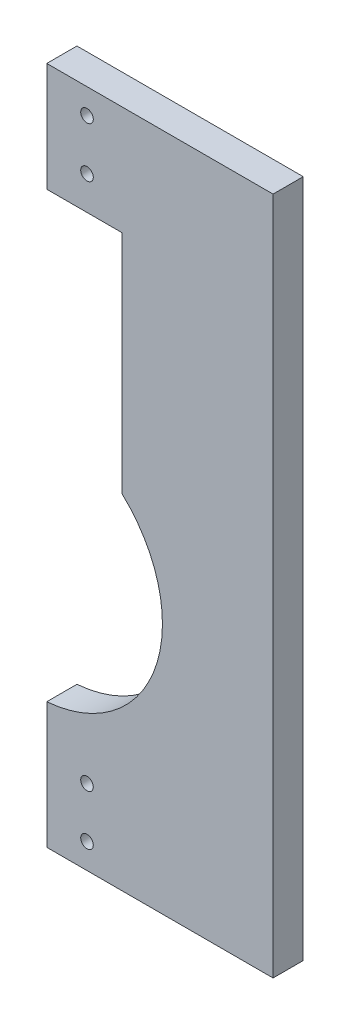
ISO-10303-21;
HEADER;
FILE_DESCRIPTION(('STEP AP214'),'2;1');
FILE_NAME('part.step','',(''),(''),'','','');
FILE_SCHEMA(('AUTOMOTIVE_DESIGN { 1 0 10303 214 1 1 1 1 }'));
ENDSEC;
DATA;
#1=APPLICATION_CONTEXT('core data for automotive mechanical design processes');
#2=APPLICATION_PROTOCOL_DEFINITION('international standard','automotive_design',2000,#1);
#3=PRODUCT_CONTEXT('',#1,'mechanical');
#4=PRODUCT('Part','Part','',(#3));
#5=PRODUCT_RELATED_PRODUCT_CATEGORY('part','',(#4));
#6=PRODUCT_DEFINITION_FORMATION('','',#4);
#7=PRODUCT_DEFINITION_CONTEXT('part definition',#1,'design');
#8=PRODUCT_DEFINITION('design','',#6,#7);
#9=PRODUCT_DEFINITION_SHAPE('','',#8);
#10=(LENGTH_UNIT() NAMED_UNIT(*) SI_UNIT(.MILLI.,.METRE.));
#11=(NAMED_UNIT(*) PLANE_ANGLE_UNIT() SI_UNIT($,.RADIAN.));
#12=(NAMED_UNIT(*) SI_UNIT($,.STERADIAN.) SOLID_ANGLE_UNIT());
#13=UNCERTAINTY_MEASURE_WITH_UNIT(LENGTH_MEASURE(1.E-05),#10,'distance_accuracy_value','');
#14=(GEOMETRIC_REPRESENTATION_CONTEXT(3) GLOBAL_UNCERTAINTY_ASSIGNED_CONTEXT((#13)) GLOBAL_UNIT_ASSIGNED_CONTEXT((#10,
#11,#12)) REPRESENTATION_CONTEXT('',''));
#15=CARTESIAN_POINT('',(0.,0.,0.));
#16=DIRECTION('',(0.,0.,1.));
#17=DIRECTION('',(1.,0.,0.));
#18=AXIS2_PLACEMENT_3D('',#15,#16,#17);
#19=CARTESIAN_POINT('',(0.,0.,6.));
#20=DIRECTION('',(1.,0.,0.));
#21=DIRECTION('',(0.,0.,-1.));
#22=AXIS2_PLACEMENT_3D('',#19,#20,#21);
#23=PLANE('',#22);
#24=DIRECTION('',(0.,-1.,0.));
#25=VECTOR('',#24,1.);
#26=CARTESIAN_POINT('',(0.,0.,6.));
#27=LINE('',#26,#25);
#28=CARTESIAN_POINT('',(0.,25.0801284112458,6.));
#29=VERTEX_POINT('',#28);
#30=CARTESIAN_POINT('',(0.,0.,6.));
#31=VERTEX_POINT('',#30);
#32=EDGE_CURVE('E122',#29,#31,#27,.T.);
#33=ORIENTED_EDGE('',*,*,#32,.F.);
#34=DIRECTION('',(0.,0.,-1.));
#35=VECTOR('',#34,1.);
#36=CARTESIAN_POINT('',(0.,25.0801284112458,6.));
#37=LINE('',#36,#35);
#38=CARTESIAN_POINT('',(0.,25.0801284112458,0.));
#39=VERTEX_POINT('',#38);
#40=EDGE_CURVE('E107',#29,#39,#37,.T.);
#41=ORIENTED_EDGE('',*,*,#40,.T.);
#42=DIRECTION('',(0.,-1.,0.));
#43=VECTOR('',#42,1.);
#44=CARTESIAN_POINT('',(0.,0.,0.));
#45=LINE('',#44,#43);
#46=CARTESIAN_POINT('',(0.,0.,0.));
#47=VERTEX_POINT('',#46);
#48=EDGE_CURVE('E143',#39,#47,#45,.T.);
#49=ORIENTED_EDGE('',*,*,#48,.T.);
#50=DIRECTION('',(0.,0.,-1.));
#51=VECTOR('',#50,1.);
#52=CARTESIAN_POINT('',(0.,0.,6.));
#53=LINE('',#52,#51);
#54=EDGE_CURVE('E127',#31,#47,#53,.T.);
#55=ORIENTED_EDGE('',*,*,#54,.F.);
#56=EDGE_LOOP('',(#33,#41,#49,#55));
#57=FACE_BOUND('',#56,.T.);
#58=ADVANCED_FACE('F33',(#57),#23,.F.);
#59=CARTESIAN_POINT('',(0.,0.,6.));
#60=DIRECTION('',(0.,0.,-1.));
#61=DIRECTION('',(-1.,0.,0.));
#62=AXIS2_PLACEMENT_3D('',#59,#60,#61);
#63=PLANE('',#62);
#64=CARTESIAN_POINT('',(7.99999999999999,120.,6.));
#65=DIRECTION('',(0.,0.,1.));
#66=DIRECTION('',(-1.,0.,0.));
#67=AXIS2_PLACEMENT_3D('',#64,#65,#66);
#68=CIRCLE('',#67,1.25);
#69=CARTESIAN_POINT('',(6.74999999999999,120.,6.));
#70=VERTEX_POINT('',#69);
#71=EDGE_CURVE('E180',#70,#70,#68,.T.);
#72=ORIENTED_EDGE('',*,*,#71,.F.);
#73=EDGE_LOOP('',(#72));
#74=FACE_BOUND('',#73,.T.);
#75=CARTESIAN_POINT('',(8.,5.,6.));
#76=DIRECTION('',(0.,0.,1.));
#77=DIRECTION('',(1.,0.,0.));
#78=AXIS2_PLACEMENT_3D('',#75,#76,#77);
#79=CIRCLE('',#78,1.25);
#80=CARTESIAN_POINT('',(9.25,5.,6.));
#81=VERTEX_POINT('',#80);
#82=EDGE_CURVE('E141',#81,#81,#79,.T.);
#83=ORIENTED_EDGE('',*,*,#82,.F.);
#84=EDGE_LOOP('',(#83));
#85=FACE_BOUND('',#84,.T.);
#86=DIRECTION('',(0.,-1.,0.));
#87=VECTOR('',#86,1.);
#88=CARTESIAN_POINT('',(15.,113.330302779823,6.));
#89=LINE('',#88,#87);
#90=CARTESIAN_POINT('',(15.,113.330302779823,6.));
#91=VERTEX_POINT('',#90);
#92=CARTESIAN_POINT('',(15.,68.3303027798234,6.));
#93=VERTEX_POINT('',#92);
#94=EDGE_CURVE('E118',#91,#93,#89,.T.);
#95=ORIENTED_EDGE('',*,*,#94,.T.);
#96=CARTESIAN_POINT('',(-2.00000000000001,50.,6.));
#97=DIRECTION('',(0.,0.,-1.));
#98=DIRECTION('',(1.,0.,0.));
#99=AXIS2_PLACEMENT_3D('',#96,#97,#98);
#100=CIRCLE('',#99,25.);
#101=EDGE_CURVE('E110',#93,#29,#100,.T.);
#102=ORIENTED_EDGE('',*,*,#101,.T.);
#103=ORIENTED_EDGE('',*,*,#32,.T.);
#104=DIRECTION('',(1.,0.,0.));
#105=VECTOR('',#104,1.);
#106=CARTESIAN_POINT('',(0.,0.,6.));
#107=LINE('',#106,#105);
#108=CARTESIAN_POINT('',(45.,0.,6.));
#109=VERTEX_POINT('',#108);
#110=EDGE_CURVE('E57',#31,#109,#107,.T.);
#111=ORIENTED_EDGE('',*,*,#110,.T.);
#112=DIRECTION('',(0.,1.,0.));
#113=VECTOR('',#112,1.);
#114=CARTESIAN_POINT('',(45.,0.,6.));
#115=LINE('',#114,#113);
#116=CARTESIAN_POINT('',(45.,135.,6.));
#117=VERTEX_POINT('',#116);
#118=EDGE_CURVE('E131',#109,#117,#115,.T.);
#119=ORIENTED_EDGE('',*,*,#118,.T.);
#120=DIRECTION('',(-1.,0.,0.));
#121=VECTOR('',#120,1.);
#122=CARTESIAN_POINT('',(0.,135.,6.));
#123=LINE('',#122,#121);
#124=CARTESIAN_POINT('',(0.,135.,6.));
#125=VERTEX_POINT('',#124);
#126=EDGE_CURVE('E85',#117,#125,#123,.T.);
#127=ORIENTED_EDGE('',*,*,#126,.T.);
#128=CARTESIAN_POINT('',(0.,113.330302779823,6.));
#129=VERTEX_POINT('',#128);
#130=EDGE_CURVE('E128',#125,#129,#27,.T.);
#131=ORIENTED_EDGE('',*,*,#130,.T.);
#132=DIRECTION('',(1.,0.,0.));
#133=VECTOR('',#132,1.);
#134=CARTESIAN_POINT('',(0.,113.330302779823,6.));
#135=LINE('',#134,#133);
#136=EDGE_CURVE('E48',#129,#91,#135,.T.);
#137=ORIENTED_EDGE('',*,*,#136,.T.);
#138=EDGE_LOOP('',(#95,#102,#103,#111,#119,#127,#131,#137));
#139=FACE_BOUND('',#138,.T.);
#140=CARTESIAN_POINT('',(7.99999999999997,15.,6.));
#141=DIRECTION('',(0.,0.,1.));
#142=DIRECTION('',(1.,0.,0.));
#143=AXIS2_PLACEMENT_3D('',#140,#141,#142);
#144=CIRCLE('',#143,1.25);
#145=CARTESIAN_POINT('',(9.24999999999997,15.,6.));
#146=VERTEX_POINT('',#145);
#147=EDGE_CURVE('E186',#146,#146,#144,.T.);
#148=ORIENTED_EDGE('',*,*,#147,.F.);
#149=EDGE_LOOP('',(#148));
#150=FACE_BOUND('',#149,.T.);
#151=CARTESIAN_POINT('',(8.00000000000003,130.,6.));
#152=DIRECTION('',(0.,0.,1.));
#153=DIRECTION('',(-1.,0.,0.));
#154=AXIS2_PLACEMENT_3D('',#151,#152,#153);
#155=CIRCLE('',#154,1.25);
#156=CARTESIAN_POINT('',(6.75000000000003,130.,6.));
#157=VERTEX_POINT('',#156);
#158=EDGE_CURVE('E174',#157,#157,#155,.T.);
#159=ORIENTED_EDGE('',*,*,#158,.F.);
#160=EDGE_LOOP('',(#159));
#161=FACE_BOUND('',#160,.T.);
#162=ADVANCED_FACE('F120',(#74,#85,#139,#150,#161),#63,.F.);
#163=CARTESIAN_POINT('',(0.,0.,0.));
#164=DIRECTION('',(0.,0.,-1.));
#165=DIRECTION('',(-1.,0.,0.));
#166=AXIS2_PLACEMENT_3D('',#163,#164,#165);
#167=PLANE('',#166);
#168=CARTESIAN_POINT('',(-2.00000000000001,50.,0.));
#169=DIRECTION('',(0.,0.,-1.));
#170=DIRECTION('',(1.,0.,0.));
#171=AXIS2_PLACEMENT_3D('',#168,#169,#170);
#172=CIRCLE('',#171,25.);
#173=CARTESIAN_POINT('',(15.,68.3303027798234,0.));
#174=VERTEX_POINT('',#173);
#175=EDGE_CURVE('E113',#174,#39,#172,.T.);
#176=ORIENTED_EDGE('',*,*,#175,.F.);
#177=DIRECTION('',(0.,-1.,0.));
#178=VECTOR('',#177,1.);
#179=CARTESIAN_POINT('',(15.,113.330302779823,0.));
#180=LINE('',#179,#178);
#181=CARTESIAN_POINT('',(15.,113.330302779823,0.));
#182=VERTEX_POINT('',#181);
#183=EDGE_CURVE('E125',#182,#174,#180,.T.);
#184=ORIENTED_EDGE('',*,*,#183,.F.);
#185=DIRECTION('',(1.,0.,0.));
#186=VECTOR('',#185,1.);
#187=CARTESIAN_POINT('',(0.,113.330302779823,0.));
#188=LINE('',#187,#186);
#189=CARTESIAN_POINT('',(0.,113.330302779823,0.));
#190=VERTEX_POINT('',#189);
#191=EDGE_CURVE('E161',#190,#182,#188,.T.);
#192=ORIENTED_EDGE('',*,*,#191,.F.);
#193=CARTESIAN_POINT('',(0.,135.,0.));
#194=VERTEX_POINT('',#193);
#195=EDGE_CURVE('E144',#194,#190,#45,.T.);
#196=ORIENTED_EDGE('',*,*,#195,.F.);
#197=DIRECTION('',(-1.,0.,0.));
#198=VECTOR('',#197,1.);
#199=CARTESIAN_POINT('',(0.,135.,0.));
#200=LINE('',#199,#198);
#201=CARTESIAN_POINT('',(45.,135.,0.));
#202=VERTEX_POINT('',#201);
#203=EDGE_CURVE('E140',#202,#194,#200,.T.);
#204=ORIENTED_EDGE('',*,*,#203,.F.);
#205=DIRECTION('',(0.,1.,0.));
#206=VECTOR('',#205,1.);
#207=CARTESIAN_POINT('',(45.,0.,0.));
#208=LINE('',#207,#206);
#209=CARTESIAN_POINT('',(45.,0.,0.));
#210=VERTEX_POINT('',#209);
#211=EDGE_CURVE('E137',#210,#202,#208,.T.);
#212=ORIENTED_EDGE('',*,*,#211,.F.);
#213=DIRECTION('',(1.,0.,0.));
#214=VECTOR('',#213,1.);
#215=CARTESIAN_POINT('',(0.,0.,0.));
#216=LINE('',#215,#214);
#217=EDGE_CURVE('E78',#47,#210,#216,.T.);
#218=ORIENTED_EDGE('',*,*,#217,.F.);
#219=ORIENTED_EDGE('',*,*,#48,.F.);
#220=EDGE_LOOP('',(#176,#184,#192,#196,#204,#212,#218,#219));
#221=FACE_BOUND('',#220,.T.);
#222=CARTESIAN_POINT('',(7.99999999999999,120.,0.));
#223=DIRECTION('',(0.,0.,1.));
#224=DIRECTION('',(-1.,0.,0.));
#225=AXIS2_PLACEMENT_3D('',#222,#223,#224);
#226=CIRCLE('',#225,1.25);
#227=CARTESIAN_POINT('',(6.74999999999999,120.,0.));
#228=VERTEX_POINT('',#227);
#229=EDGE_CURVE('E177',#228,#228,#226,.T.);
#230=ORIENTED_EDGE('',*,*,#229,.T.);
#231=EDGE_LOOP('',(#230));
#232=FACE_BOUND('',#231,.T.);
#233=CARTESIAN_POINT('',(8.,5.,0.));
#234=DIRECTION('',(0.,0.,1.));
#235=DIRECTION('',(1.,0.,0.));
#236=AXIS2_PLACEMENT_3D('',#233,#234,#235);
#237=CIRCLE('',#236,1.25);
#238=CARTESIAN_POINT('',(9.25,5.,0.));
#239=VERTEX_POINT('',#238);
#240=EDGE_CURVE('E189',#239,#239,#237,.T.);
#241=ORIENTED_EDGE('',*,*,#240,.T.);
#242=EDGE_LOOP('',(#241));
#243=FACE_BOUND('',#242,.T.);
#244=CARTESIAN_POINT('',(7.99999999999997,15.,0.));
#245=DIRECTION('',(0.,0.,1.));
#246=DIRECTION('',(1.,0.,0.));
#247=AXIS2_PLACEMENT_3D('',#244,#245,#246);
#248=CIRCLE('',#247,1.25);
#249=CARTESIAN_POINT('',(9.24999999999997,15.,0.));
#250=VERTEX_POINT('',#249);
#251=EDGE_CURVE('E183',#250,#250,#248,.T.);
#252=ORIENTED_EDGE('',*,*,#251,.T.);
#253=EDGE_LOOP('',(#252));
#254=FACE_BOUND('',#253,.T.);
#255=CARTESIAN_POINT('',(8.00000000000003,130.,0.));
#256=DIRECTION('',(0.,0.,1.));
#257=DIRECTION('',(-1.,0.,0.));
#258=AXIS2_PLACEMENT_3D('',#255,#256,#257);
#259=CIRCLE('',#258,1.25);
#260=CARTESIAN_POINT('',(6.75000000000003,130.,0.));
#261=VERTEX_POINT('',#260);
#262=EDGE_CURVE('E170',#261,#261,#259,.T.);
#263=ORIENTED_EDGE('',*,*,#262,.T.);
#264=EDGE_LOOP('',(#263));
#265=FACE_BOUND('',#264,.T.);
#266=ADVANCED_FACE('F156',(#221,#232,#243,#254,#265),#167,.T.);
#267=CARTESIAN_POINT('',(45.,0.,6.));
#268=DIRECTION('',(-1.,0.,0.));
#269=DIRECTION('',(0.,0.,1.));
#270=AXIS2_PLACEMENT_3D('',#267,#268,#269);
#271=PLANE('',#270);
#272=ORIENTED_EDGE('',*,*,#211,.T.);
#273=DIRECTION('',(0.,0.,-1.));
#274=VECTOR('',#273,1.);
#275=CARTESIAN_POINT('',(45.,135.,6.));
#276=LINE('',#275,#274);
#277=EDGE_CURVE('E11',#117,#202,#276,.T.);
#278=ORIENTED_EDGE('',*,*,#277,.F.);
#279=ORIENTED_EDGE('',*,*,#118,.F.);
#280=DIRECTION('',(0.,0.,-1.));
#281=VECTOR('',#280,1.);
#282=CARTESIAN_POINT('',(45.,0.,6.));
#283=LINE('',#282,#281);
#284=EDGE_CURVE('E136',#109,#210,#283,.T.);
#285=ORIENTED_EDGE('',*,*,#284,.T.);
#286=EDGE_LOOP('',(#272,#278,#279,#285));
#287=FACE_BOUND('',#286,.T.);
#288=ADVANCED_FACE('F35',(#287),#271,.F.);
#289=CARTESIAN_POINT('',(0.,135.,6.));
#290=DIRECTION('',(0.,-1.,0.));
#291=DIRECTION('',(0.,0.,-1.));
#292=AXIS2_PLACEMENT_3D('',#289,#290,#291);
#293=PLANE('',#292);
#294=ORIENTED_EDGE('',*,*,#203,.T.);
#295=DIRECTION('',(0.,0.,-1.));
#296=VECTOR('',#295,1.);
#297=CARTESIAN_POINT('',(0.,135.,6.));
#298=LINE('',#297,#296);
#299=EDGE_CURVE('E41',#125,#194,#298,.T.);
#300=ORIENTED_EDGE('',*,*,#299,.F.);
#301=ORIENTED_EDGE('',*,*,#126,.F.);
#302=ORIENTED_EDGE('',*,*,#277,.T.);
#303=EDGE_LOOP('',(#294,#300,#301,#302));
#304=FACE_BOUND('',#303,.T.);
#305=ADVANCED_FACE('F198',(#304),#293,.F.);
#306=ORIENTED_EDGE('',*,*,#195,.T.);
#307=DIRECTION('',(0.,0.,-1.));
#308=VECTOR('',#307,1.);
#309=CARTESIAN_POINT('',(0.,113.330302779823,6.));
#310=LINE('',#309,#308);
#311=EDGE_CURVE('E117',#129,#190,#310,.T.);
#312=ORIENTED_EDGE('',*,*,#311,.F.);
#313=ORIENTED_EDGE('',*,*,#130,.F.);
#314=ORIENTED_EDGE('',*,*,#299,.T.);
#315=EDGE_LOOP('',(#306,#312,#313,#314));
#316=FACE_BOUND('',#315,.T.);
#317=ADVANCED_FACE('F153',(#316),#23,.F.);
#318=CARTESIAN_POINT('',(0.,0.,6.));
#319=DIRECTION('',(0.,1.,0.));
#320=DIRECTION('',(0.,0.,1.));
#321=AXIS2_PLACEMENT_3D('',#318,#319,#320);
#322=PLANE('',#321);
#323=ORIENTED_EDGE('',*,*,#217,.T.);
#324=ORIENTED_EDGE('',*,*,#284,.F.);
#325=ORIENTED_EDGE('',*,*,#110,.F.);
#326=ORIENTED_EDGE('',*,*,#54,.T.);
#327=EDGE_LOOP('',(#323,#324,#325,#326));
#328=FACE_BOUND('',#327,.T.);
#329=ADVANCED_FACE('F204',(#328),#322,.F.);
#330=CARTESIAN_POINT('',(8.,5.,6.));
#331=DIRECTION('',(0.,0.,-1.));
#332=DIRECTION('',(-1.,0.,0.));
#333=AXIS2_PLACEMENT_3D('',#330,#331,#332);
#334=CYLINDRICAL_SURFACE('',#333,1.25);
#335=ORIENTED_EDGE('',*,*,#82,.T.);
#336=EDGE_LOOP('',(#335));
#337=FACE_BOUND('',#336,.T.);
#338=ORIENTED_EDGE('',*,*,#240,.F.);
#339=EDGE_LOOP('',(#338));
#340=FACE_BOUND('',#339,.T.);
#341=ADVANCED_FACE('F215',(#337,#340),#334,.F.);
#342=CARTESIAN_POINT('',(7.99999999999997,15.,6.));
#343=DIRECTION('',(0.,0.,-1.));
#344=DIRECTION('',(-1.,0.,0.));
#345=AXIS2_PLACEMENT_3D('',#342,#343,#344);
#346=CYLINDRICAL_SURFACE('',#345,1.25);
#347=ORIENTED_EDGE('',*,*,#147,.T.);
#348=EDGE_LOOP('',(#347));
#349=FACE_BOUND('',#348,.T.);
#350=ORIENTED_EDGE('',*,*,#251,.F.);
#351=EDGE_LOOP('',(#350));
#352=FACE_BOUND('',#351,.T.);
#353=ADVANCED_FACE('F220',(#349,#352),#346,.F.);
#354=CARTESIAN_POINT('',(7.99999999999999,120.,6.));
#355=DIRECTION('',(0.,0.,-1.));
#356=DIRECTION('',(-1.,0.,0.));
#357=AXIS2_PLACEMENT_3D('',#354,#355,#356);
#358=CYLINDRICAL_SURFACE('',#357,1.25);
#359=ORIENTED_EDGE('',*,*,#71,.T.);
#360=EDGE_LOOP('',(#359));
#361=FACE_BOUND('',#360,.T.);
#362=ORIENTED_EDGE('',*,*,#229,.F.);
#363=EDGE_LOOP('',(#362));
#364=FACE_BOUND('',#363,.T.);
#365=ADVANCED_FACE('F224',(#361,#364),#358,.F.);
#366=CARTESIAN_POINT('',(8.00000000000003,130.,6.));
#367=DIRECTION('',(0.,0.,-1.));
#368=DIRECTION('',(-1.,0.,0.));
#369=AXIS2_PLACEMENT_3D('',#366,#367,#368);
#370=CYLINDRICAL_SURFACE('',#369,1.25);
#371=ORIENTED_EDGE('',*,*,#158,.T.);
#372=EDGE_LOOP('',(#371));
#373=FACE_BOUND('',#372,.T.);
#374=ORIENTED_EDGE('',*,*,#262,.F.);
#375=EDGE_LOOP('',(#374));
#376=FACE_BOUND('',#375,.T.);
#377=ADVANCED_FACE('F228',(#373,#376),#370,.F.);
#378=CARTESIAN_POINT('',(-2.00000000000001,50.,6.));
#379=DIRECTION('',(0.,0.,-1.));
#380=DIRECTION('',(-1.,0.,0.));
#381=AXIS2_PLACEMENT_3D('',#378,#379,#380);
#382=CYLINDRICAL_SURFACE('',#381,25.);
#383=ORIENTED_EDGE('',*,*,#175,.T.);
#384=ORIENTED_EDGE('',*,*,#40,.F.);
#385=ORIENTED_EDGE('',*,*,#101,.F.);
#386=DIRECTION('',(0.,0.,-1.));
#387=VECTOR('',#386,1.);
#388=CARTESIAN_POINT('',(15.,68.3303027798234,6.));
#389=LINE('',#388,#387);
#390=EDGE_CURVE('E168',#93,#174,#389,.T.);
#391=ORIENTED_EDGE('',*,*,#390,.T.);
#392=EDGE_LOOP('',(#383,#384,#385,#391));
#393=FACE_BOUND('',#392,.T.);
#394=ADVANCED_FACE('F109',(#393),#382,.F.);
#395=CARTESIAN_POINT('',(15.,113.330302779823,6.));
#396=DIRECTION('',(1.,0.,0.));
#397=DIRECTION('',(0.,0.,-1.));
#398=AXIS2_PLACEMENT_3D('',#395,#396,#397);
#399=PLANE('',#398);
#400=ORIENTED_EDGE('',*,*,#183,.T.);
#401=ORIENTED_EDGE('',*,*,#390,.F.);
#402=ORIENTED_EDGE('',*,*,#94,.F.);
#403=DIRECTION('',(0.,0.,-1.));
#404=VECTOR('',#403,1.);
#405=CARTESIAN_POINT('',(15.,113.330302779823,6.));
#406=LINE('',#405,#404);
#407=EDGE_CURVE('E171',#91,#182,#406,.T.);
#408=ORIENTED_EDGE('',*,*,#407,.T.);
#409=EDGE_LOOP('',(#400,#401,#402,#408));
#410=FACE_BOUND('',#409,.T.);
#411=ADVANCED_FACE('F235',(#410),#399,.F.);
#412=CARTESIAN_POINT('',(0.,113.330302779823,6.));
#413=DIRECTION('',(0.,1.,0.));
#414=DIRECTION('',(-1.,0.,0.));
#415=AXIS2_PLACEMENT_3D('',#412,#413,#414);
#416=PLANE('',#415);
#417=ORIENTED_EDGE('',*,*,#191,.T.);
#418=ORIENTED_EDGE('',*,*,#407,.F.);
#419=ORIENTED_EDGE('',*,*,#136,.F.);
#420=ORIENTED_EDGE('',*,*,#311,.T.);
#421=EDGE_LOOP('',(#417,#418,#419,#420));
#422=FACE_BOUND('',#421,.T.);
#423=ADVANCED_FACE('F236',(#422),#416,.F.);
#424=CLOSED_SHELL('',(#58,#162,#266,#288,#305,#317,#329,#341,#353,#365,#377,#394,#411,#423));
#425=MANIFOLD_SOLID_BREP('B2',#424);
#426=ADVANCED_BREP_SHAPE_REPRESENTATION('',(#18,#425),#14);
#427=SHAPE_DEFINITION_REPRESENTATION(#9,#426);
ENDSEC;
END-ISO-10303-21;
